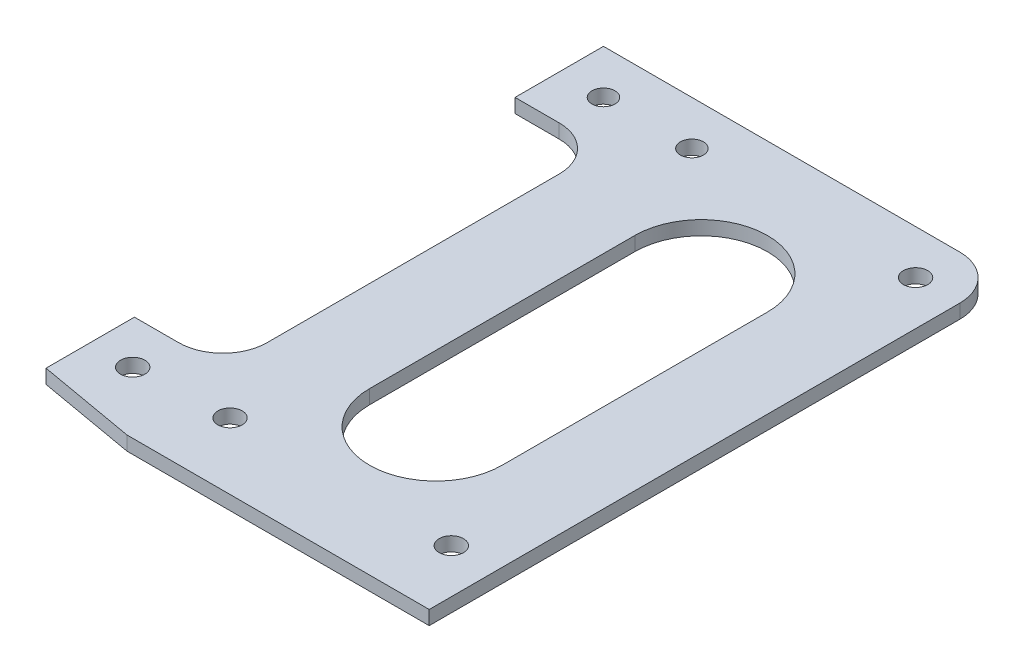
ISO-10303-21;
HEADER;
FILE_DESCRIPTION(('STEP AP214'),'2;1');
FILE_NAME('part.step','',(''),(''),'','','');
FILE_SCHEMA(('AUTOMOTIVE_DESIGN { 1 0 10303 214 1 1 1 1 }'));
ENDSEC;
DATA;
#1=APPLICATION_CONTEXT('core data for automotive mechanical design processes');
#2=APPLICATION_PROTOCOL_DEFINITION('international standard','automotive_design',2000,#1);
#3=PRODUCT_CONTEXT('',#1,'mechanical');
#4=PRODUCT('Part','Part','',(#3));
#5=PRODUCT_RELATED_PRODUCT_CATEGORY('part','',(#4));
#6=PRODUCT_DEFINITION_FORMATION('','',#4);
#7=PRODUCT_DEFINITION_CONTEXT('part definition',#1,'design');
#8=PRODUCT_DEFINITION('design','',#6,#7);
#9=PRODUCT_DEFINITION_SHAPE('','',#8);
#10=(LENGTH_UNIT() NAMED_UNIT(*) SI_UNIT(.MILLI.,.METRE.));
#11=(NAMED_UNIT(*) PLANE_ANGLE_UNIT() SI_UNIT($,.RADIAN.));
#12=(NAMED_UNIT(*) SI_UNIT($,.STERADIAN.) SOLID_ANGLE_UNIT());
#13=UNCERTAINTY_MEASURE_WITH_UNIT(LENGTH_MEASURE(1.E-05),#10,'distance_accuracy_value','');
#14=(GEOMETRIC_REPRESENTATION_CONTEXT(3) GLOBAL_UNCERTAINTY_ASSIGNED_CONTEXT((#13)) GLOBAL_UNIT_ASSIGNED_CONTEXT((#10,
#11,#12)) REPRESENTATION_CONTEXT('',''));
#15=CARTESIAN_POINT('',(0.,0.,0.));
#16=DIRECTION('',(0.,0.,1.));
#17=DIRECTION('',(1.,0.,0.));
#18=AXIS2_PLACEMENT_3D('',#15,#16,#17);
#19=CARTESIAN_POINT('',(-104.922239506293,35.3097367286682,-36.2734435331109));
#20=DIRECTION('',(-1.,0.,0.));
#21=DIRECTION('',(0.,0.,1.));
#22=AXIS2_PLACEMENT_3D('',#19,#20,#21);
#23=PLANE('',#22);
#24=DIRECTION('',(0.,1.,0.));
#25=VECTOR('',#24,1.);
#26=CARTESIAN_POINT('',(-104.922239506293,32.1347367286682,-142.35));
#27=LINE('',#26,#25);
#28=CARTESIAN_POINT('',(-104.922239506293,32.1347367286682,-142.35));
#29=VERTEX_POINT('',#28);
#30=CARTESIAN_POINT('',(-104.922239506293,35.3097367286682,-142.35));
#31=VERTEX_POINT('',#30);
#32=EDGE_CURVE('E204',#29,#31,#27,.T.);
#33=ORIENTED_EDGE('',*,*,#32,.T.);
#34=DIRECTION('',(0.,0.,-1.));
#35=VECTOR('',#34,1.);
#36=CARTESIAN_POINT('',(-104.922239506293,35.3097367286682,-36.2734435331109));
#37=LINE('',#36,#35);
#38=CARTESIAN_POINT('',(-104.922239506293,35.3097367286682,-162.35));
#39=VERTEX_POINT('',#38);
#40=EDGE_CURVE('E237',#31,#39,#37,.T.);
#41=ORIENTED_EDGE('',*,*,#40,.T.);
#42=DIRECTION('',(0.,-1.,0.));
#43=VECTOR('',#42,1.);
#44=CARTESIAN_POINT('',(-104.922239506293,35.3097367286682,-162.35));
#45=LINE('',#44,#43);
#46=CARTESIAN_POINT('',(-104.922239506293,32.1347367286682,-162.35));
#47=VERTEX_POINT('',#46);
#48=EDGE_CURVE('E270',#39,#47,#45,.T.);
#49=ORIENTED_EDGE('',*,*,#48,.T.);
#50=DIRECTION('',(0.,0.,-1.));
#51=VECTOR('',#50,1.);
#52=CARTESIAN_POINT('',(-104.922239506293,32.1347367286682,-36.2734435331109));
#53=LINE('',#52,#51);
#54=EDGE_CURVE('E255',#29,#47,#53,.T.);
#55=ORIENTED_EDGE('',*,*,#54,.F.);
#56=EDGE_LOOP('',(#33,#41,#49,#55));
#57=FACE_BOUND('',#56,.T.);
#58=ADVANCED_FACE('F34',(#57),#23,.T.);
#59=CARTESIAN_POINT('',(-14.3331001776119,35.3097367286682,-32.3499999999996));
#60=DIRECTION('',(0.,0.,1.));
#61=DIRECTION('',(1.,0.,0.));
#62=AXIS2_PLACEMENT_3D('',#59,#60,#61);
#63=PLANE('',#62);
#64=DIRECTION('',(-1.,0.,0.));
#65=VECTOR('',#64,1.);
#66=CARTESIAN_POINT('',(-14.3331001776119,32.1347367286682,-32.3499999999996));
#67=LINE('',#66,#65);
#68=CARTESIAN_POINT('',(-14.3331001776119,32.1347367286682,-32.3499999999996));
#69=VERTEX_POINT('',#68);
#70=CARTESIAN_POINT('',(-82.671285526662,32.1347367286682,-32.3499999999997));
#71=VERTEX_POINT('',#70);
#72=EDGE_CURVE('E219',#69,#71,#67,.T.);
#73=ORIENTED_EDGE('',*,*,#72,.F.);
#74=DIRECTION('',(0.,-1.,0.));
#75=VECTOR('',#74,1.);
#76=CARTESIAN_POINT('',(-14.3331001776119,35.3097367286682,-32.3499999999996));
#77=LINE('',#76,#75);
#78=CARTESIAN_POINT('',(-14.3331001776119,35.3097367286682,-32.3499999999996));
#79=VERTEX_POINT('',#78);
#80=EDGE_CURVE('E11',#79,#69,#77,.T.);
#81=ORIENTED_EDGE('',*,*,#80,.F.);
#82=DIRECTION('',(-1.,0.,0.));
#83=VECTOR('',#82,1.);
#84=CARTESIAN_POINT('',(-14.3331001776119,35.3097367286682,-32.3499999999996));
#85=LINE('',#84,#83);
#86=CARTESIAN_POINT('',(-82.671285526662,35.3097367286682,-32.3499999999997));
#87=VERTEX_POINT('',#86);
#88=EDGE_CURVE('E230',#79,#87,#85,.T.);
#89=ORIENTED_EDGE('',*,*,#88,.T.);
#90=DIRECTION('',(0.,-1.,0.));
#91=VECTOR('',#90,1.);
#92=CARTESIAN_POINT('',(-82.671285526662,35.3097367286682,-32.3499999999997));
#93=LINE('',#92,#91);
#94=EDGE_CURVE('E38',#87,#71,#93,.T.);
#95=ORIENTED_EDGE('',*,*,#94,.T.);
#96=EDGE_LOOP('',(#73,#81,#89,#95));
#97=FACE_BOUND('',#96,.T.);
#98=ADVANCED_FACE('F36',(#97),#63,.T.);
#99=CARTESIAN_POINT('',(-14.3331001776119,35.3097367286682,-152.35));
#100=DIRECTION('',(1.,0.,0.));
#101=DIRECTION('',(0.,0.,-1.));
#102=AXIS2_PLACEMENT_3D('',#99,#100,#101);
#103=PLANE('',#102);
#104=DIRECTION('',(0.,0.,1.));
#105=VECTOR('',#104,1.);
#106=CARTESIAN_POINT('',(-14.3331001776119,32.1347367286682,-152.35));
#107=LINE('',#106,#105);
#108=CARTESIAN_POINT('',(-14.3331001776119,32.1347367286682,-152.35));
#109=VERTEX_POINT('',#108);
#110=EDGE_CURVE('E234',#109,#69,#107,.T.);
#111=ORIENTED_EDGE('',*,*,#110,.F.);
#112=DIRECTION('',(0.,-1.,0.));
#113=VECTOR('',#112,1.);
#114=CARTESIAN_POINT('',(-14.3331001776119,35.3097367286682,-152.35));
#115=LINE('',#114,#113);
#116=CARTESIAN_POINT('',(-14.3331001776119,35.3097367286682,-152.35));
#117=VERTEX_POINT('',#116);
#118=EDGE_CURVE('E43',#117,#109,#115,.T.);
#119=ORIENTED_EDGE('',*,*,#118,.F.);
#120=DIRECTION('',(0.,0.,1.));
#121=VECTOR('',#120,1.);
#122=CARTESIAN_POINT('',(-14.3331001776119,35.3097367286682,-152.35));
#123=LINE('',#122,#121);
#124=EDGE_CURVE('E247',#117,#79,#123,.T.);
#125=ORIENTED_EDGE('',*,*,#124,.T.);
#126=ORIENTED_EDGE('',*,*,#80,.T.);
#127=EDGE_LOOP('',(#111,#119,#125,#126));
#128=FACE_BOUND('',#127,.T.);
#129=ADVANCED_FACE('F284',(#128),#103,.T.);
#130=CARTESIAN_POINT('',(-24.3331001776119,35.3097367286682,-152.35));
#131=DIRECTION('',(0.,-1.,0.));
#132=DIRECTION('',(0.,0.,-1.));
#133=AXIS2_PLACEMENT_3D('',#130,#131,#132);
#134=CYLINDRICAL_SURFACE('',#133,10.);
#135=CARTESIAN_POINT('',(-24.3331001776119,32.1347367286682,-152.35));
#136=DIRECTION('',(0.,-1.,0.));
#137=DIRECTION('',(0.,0.,-1.));
#138=AXIS2_PLACEMENT_3D('',#135,#136,#137);
#139=CIRCLE('',#138,10.);
#140=CARTESIAN_POINT('',(-24.3331001776119,32.1347367286682,-162.35));
#141=VERTEX_POINT('',#140);
#142=EDGE_CURVE('E262',#141,#109,#139,.T.);
#143=ORIENTED_EDGE('',*,*,#142,.F.);
#144=DIRECTION('',(0.,-1.,0.));
#145=VECTOR('',#144,1.);
#146=CARTESIAN_POINT('',(-24.3331001776119,35.3097367286682,-162.35));
#147=LINE('',#146,#145);
#148=CARTESIAN_POINT('',(-24.3331001776119,35.3097367286682,-162.35));
#149=VERTEX_POINT('',#148);
#150=EDGE_CURVE('E268',#149,#141,#147,.T.);
#151=ORIENTED_EDGE('',*,*,#150,.F.);
#152=CARTESIAN_POINT('',(-24.3331001776119,35.3097367286682,-152.35));
#153=DIRECTION('',(0.,-1.,0.));
#154=DIRECTION('',(0.,0.,-1.));
#155=AXIS2_PLACEMENT_3D('',#152,#153,#154);
#156=CIRCLE('',#155,10.);
#157=EDGE_CURVE('E244',#149,#117,#156,.T.);
#158=ORIENTED_EDGE('',*,*,#157,.T.);
#159=ORIENTED_EDGE('',*,*,#118,.T.);
#160=EDGE_LOOP('',(#143,#151,#158,#159));
#161=FACE_BOUND('',#160,.T.);
#162=ADVANCED_FACE('F321',(#161),#134,.T.);
#163=CARTESIAN_POINT('',(-104.922239506293,35.3097367286682,-162.35));
#164=DIRECTION('',(0.,0.,-1.));
#165=DIRECTION('',(-1.,0.,0.));
#166=AXIS2_PLACEMENT_3D('',#163,#164,#165);
#167=PLANE('',#166);
#168=DIRECTION('',(1.,0.,0.));
#169=VECTOR('',#168,1.);
#170=CARTESIAN_POINT('',(-104.922239506293,32.1347367286682,-162.35));
#171=LINE('',#170,#169);
#172=EDGE_CURVE('E259',#47,#141,#171,.T.);
#173=ORIENTED_EDGE('',*,*,#172,.F.);
#174=ORIENTED_EDGE('',*,*,#48,.F.);
#175=DIRECTION('',(1.,0.,0.));
#176=VECTOR('',#175,1.);
#177=CARTESIAN_POINT('',(-104.922239506293,35.3097367286682,-162.35));
#178=LINE('',#177,#176);
#179=EDGE_CURVE('E241',#39,#149,#178,.T.);
#180=ORIENTED_EDGE('',*,*,#179,.T.);
#181=ORIENTED_EDGE('',*,*,#150,.T.);
#182=EDGE_LOOP('',(#173,#174,#180,#181));
#183=FACE_BOUND('',#182,.T.);
#184=ADVANCED_FACE('F319',(#183),#167,.T.);
#185=DIRECTION('',(0.,1.,0.));
#186=VECTOR('',#185,1.);
#187=CARTESIAN_POINT('',(-104.922239506293,32.1347367286682,-56.2734435331109));
#188=LINE('',#187,#186);
#189=CARTESIAN_POINT('',(-104.922239506293,32.1347367286682,-56.2734435331109));
#190=VERTEX_POINT('',#189);
#191=CARTESIAN_POINT('',(-104.922239506293,35.3097367286682,-56.2734435331109));
#192=VERTEX_POINT('',#191);
#193=EDGE_CURVE('E226',#190,#192,#188,.T.);
#194=ORIENTED_EDGE('',*,*,#193,.F.);
#195=CARTESIAN_POINT('',(-104.922239506293,32.1347367286682,-36.2734435331109));
#196=VERTEX_POINT('',#195);
#197=EDGE_CURVE('E256',#196,#190,#53,.T.);
#198=ORIENTED_EDGE('',*,*,#197,.F.);
#199=DIRECTION('',(0.,-1.,0.));
#200=VECTOR('',#199,1.);
#201=CARTESIAN_POINT('',(-104.922239506293,35.3097367286682,-36.2734435331109));
#202=LINE('',#201,#200);
#203=CARTESIAN_POINT('',(-104.922239506293,35.3097367286682,-36.2734435331109));
#204=VERTEX_POINT('',#203);
#205=EDGE_CURVE('E272',#204,#196,#202,.T.);
#206=ORIENTED_EDGE('',*,*,#205,.F.);
#207=EDGE_CURVE('E238',#204,#192,#37,.T.);
#208=ORIENTED_EDGE('',*,*,#207,.T.);
#209=EDGE_LOOP('',(#194,#198,#206,#208));
#210=FACE_BOUND('',#209,.T.);
#211=ADVANCED_FACE('F295',(#210),#23,.T.);
#212=CARTESIAN_POINT('',(-82.671285526662,35.3097367286682,-32.3499999999997));
#213=DIRECTION('',(-0.173648177666928,0.,0.984807753012208));
#214=DIRECTION('',(0.984807753012208,0.,0.173648177666928));
#215=AXIS2_PLACEMENT_3D('',#212,#213,#214);
#216=PLANE('',#215);
#217=DIRECTION('',(-0.984807753012208,0.,-0.173648177666928));
#218=VECTOR('',#217,1.);
#219=CARTESIAN_POINT('',(-82.671285526662,32.1347367286682,-32.3499999999997));
#220=LINE('',#219,#218);
#221=EDGE_CURVE('E252',#71,#196,#220,.T.);
#222=ORIENTED_EDGE('',*,*,#221,.F.);
#223=ORIENTED_EDGE('',*,*,#94,.F.);
#224=DIRECTION('',(-0.984807753012208,0.,-0.173648177666928));
#225=VECTOR('',#224,1.);
#226=CARTESIAN_POINT('',(-82.671285526662,35.3097367286682,-32.3499999999997));
#227=LINE('',#226,#225);
#228=EDGE_CURVE('E233',#87,#204,#227,.T.);
#229=ORIENTED_EDGE('',*,*,#228,.T.);
#230=ORIENTED_EDGE('',*,*,#205,.T.);
#231=EDGE_LOOP('',(#222,#223,#229,#230));
#232=FACE_BOUND('',#231,.T.);
#233=ADVANCED_FACE('F280',(#232),#216,.T.);
#234=CARTESIAN_POINT('',(-24.3331001776119,35.3097367286682,-152.35));
#235=DIRECTION('',(0.,-1.,0.));
#236=DIRECTION('',(0.,0.,-1.));
#237=AXIS2_PLACEMENT_3D('',#234,#235,#236);
#238=PLANE('',#237);
#239=CARTESIAN_POINT('',(-95.3160583972932,35.3097367286682,-46.2734435331109));
#240=DIRECTION('',(0.,-1.,0.));
#241=DIRECTION('',(0.,0.,-1.));
#242=AXIS2_PLACEMENT_3D('',#239,#240,#241);
#243=CIRCLE('',#242,2.74999999999999);
#244=CARTESIAN_POINT('',(-95.3160583972932,35.3097367286682,-49.0234435331109));
#245=VERTEX_POINT('',#244);
#246=EDGE_CURVE('E400',#245,#245,#243,.T.);
#247=ORIENTED_EDGE('',*,*,#246,.T.);
#248=EDGE_LOOP('',(#247));
#249=FACE_BOUND('',#248,.T.);
#250=CARTESIAN_POINT('',(-74.375466885923,35.3097367286682,-47.3499999999996));
#251=DIRECTION('',(0.,-1.,0.));
#252=DIRECTION('',(0.,0.,-1.));
#253=AXIS2_PLACEMENT_3D('',#250,#251,#252);
#254=CIRCLE('',#253,2.74999999999999);
#255=CARTESIAN_POINT('',(-74.375466885923,35.3097367286682,-50.0999999999996));
#256=VERTEX_POINT('',#255);
#257=EDGE_CURVE('E410',#256,#256,#254,.T.);
#258=ORIENTED_EDGE('',*,*,#257,.T.);
#259=EDGE_LOOP('',(#258));
#260=FACE_BOUND('',#259,.T.);
#261=CARTESIAN_POINT('',(-24.3331001776119,35.3097367286682,-47.3499999999996));
#262=DIRECTION('',(0.,-1.,0.));
#263=DIRECTION('',(0.,0.,-1.));
#264=AXIS2_PLACEMENT_3D('',#261,#262,#263);
#265=CIRCLE('',#264,2.74999999999999);
#266=CARTESIAN_POINT('',(-24.3331001776119,35.3097367286682,-50.0999999999996));
#267=VERTEX_POINT('',#266);
#268=EDGE_CURVE('E416',#267,#267,#265,.T.);
#269=ORIENTED_EDGE('',*,*,#268,.T.);
#270=EDGE_LOOP('',(#269));
#271=FACE_BOUND('',#270,.T.);
#272=CARTESIAN_POINT('',(-24.3331001776119,35.3097367286682,-152.35));
#273=DIRECTION('',(0.,-1.,0.));
#274=DIRECTION('',(0.,0.,-1.));
#275=AXIS2_PLACEMENT_3D('',#272,#273,#274);
#276=CIRCLE('',#275,2.74999999999999);
#277=CARTESIAN_POINT('',(-24.3331001776119,35.3097367286682,-155.1));
#278=VERTEX_POINT('',#277);
#279=EDGE_CURVE('E422',#278,#278,#276,.T.);
#280=ORIENTED_EDGE('',*,*,#279,.T.);
#281=EDGE_LOOP('',(#280));
#282=FACE_BOUND('',#281,.T.);
#283=CARTESIAN_POINT('',(-94.922239506293,35.3097367286682,-152.35));
#284=DIRECTION('',(0.,-1.,0.));
#285=DIRECTION('',(0.,0.,-1.));
#286=AXIS2_PLACEMENT_3D('',#283,#284,#285);
#287=CIRCLE('',#286,2.59999999999998);
#288=CARTESIAN_POINT('',(-94.922239506293,35.3097367286682,-154.95));
#289=VERTEX_POINT('',#288);
#290=EDGE_CURVE('E428',#289,#289,#287,.T.);
#291=ORIENTED_EDGE('',*,*,#290,.T.);
#292=EDGE_LOOP('',(#291));
#293=FACE_BOUND('',#292,.T.);
#294=CARTESIAN_POINT('',(-74.922239506293,35.3097367286682,-152.35));
#295=DIRECTION('',(0.,-1.,0.));
#296=DIRECTION('',(0.,0.,-1.));
#297=AXIS2_PLACEMENT_3D('',#294,#295,#296);
#298=CIRCLE('',#297,2.59999999999998);
#299=CARTESIAN_POINT('',(-74.922239506293,35.3097367286682,-154.95));
#300=VERTEX_POINT('',#299);
#301=EDGE_CURVE('E172',#300,#300,#298,.T.);
#302=ORIENTED_EDGE('',*,*,#301,.T.);
#303=EDGE_LOOP('',(#302));
#304=FACE_BOUND('',#303,.T.);
#305=DIRECTION('',(0.,0.,1.));
#306=VECTOR('',#305,1.);
#307=CARTESIAN_POINT('',(-64.3331001776119,35.3097367286682,-128.85));
#308=LINE('',#307,#306);
#309=CARTESIAN_POINT('',(-64.3331001776119,35.3097367286682,-128.85));
#310=VERTEX_POINT('',#309);
#311=CARTESIAN_POINT('',(-64.333100177612,35.3097367286682,-68.8499999999997));
#312=VERTEX_POINT('',#311);
#313=EDGE_CURVE('E178',#310,#312,#308,.T.);
#314=ORIENTED_EDGE('',*,*,#313,.F.);
#315=CARTESIAN_POINT('',(-49.3331001776118,35.3097367286682,-128.85));
#316=DIRECTION('',(0.,1.,0.));
#317=DIRECTION('',(0.,0.,1.));
#318=AXIS2_PLACEMENT_3D('',#315,#316,#317);
#319=CIRCLE('',#318,15.);
#320=CARTESIAN_POINT('',(-34.3331001776118,35.3097367286682,-128.85));
#321=VERTEX_POINT('',#320);
#322=EDGE_CURVE('E51',#321,#310,#319,.T.);
#323=ORIENTED_EDGE('',*,*,#322,.F.);
#324=DIRECTION('',(0.,0.,-1.));
#325=VECTOR('',#324,1.);
#326=CARTESIAN_POINT('',(-34.3331001776119,35.3097367286682,-68.8499999999996));
#327=LINE('',#326,#325);
#328=CARTESIAN_POINT('',(-34.3331001776119,35.3097367286682,-68.8499999999996));
#329=VERTEX_POINT('',#328);
#330=EDGE_CURVE('E166',#329,#321,#327,.T.);
#331=ORIENTED_EDGE('',*,*,#330,.F.);
#332=CARTESIAN_POINT('',(-49.333100177612,35.3097367286682,-68.8499999999996));
#333=DIRECTION('',(0.,1.,0.));
#334=DIRECTION('',(0.,0.,1.));
#335=AXIS2_PLACEMENT_3D('',#332,#333,#334);
#336=CIRCLE('',#335,15.);
#337=EDGE_CURVE('E169',#312,#329,#336,.T.);
#338=ORIENTED_EDGE('',*,*,#337,.F.);
#339=EDGE_LOOP('',(#314,#323,#331,#338));
#340=FACE_BOUND('',#339,.T.);
#341=ORIENTED_EDGE('',*,*,#40,.F.);
#342=DIRECTION('',(-1.,0.,0.));
#343=VECTOR('',#342,1.);
#344=CARTESIAN_POINT('',(-94.922239506293,35.3097367286682,-142.35));
#345=LINE('',#344,#343);
#346=CARTESIAN_POINT('',(-94.922239506293,35.3097367286682,-142.35));
#347=VERTEX_POINT('',#346);
#348=EDGE_CURVE('E184',#347,#31,#345,.T.);
#349=ORIENTED_EDGE('',*,*,#348,.F.);
#350=CARTESIAN_POINT('',(-94.922239506293,35.3097367286682,-132.35));
#351=DIRECTION('',(0.,1.,0.));
#352=DIRECTION('',(0.,0.,1.));
#353=AXIS2_PLACEMENT_3D('',#350,#351,#352);
#354=CIRCLE('',#353,10.);
#355=CARTESIAN_POINT('',(-84.922239506293,35.3097367286682,-132.35));
#356=VERTEX_POINT('',#355);
#357=EDGE_CURVE('E192',#356,#347,#354,.T.);
#358=ORIENTED_EDGE('',*,*,#357,.F.);
#359=DIRECTION('',(0.,0.,-1.));
#360=VECTOR('',#359,1.);
#361=CARTESIAN_POINT('',(-84.922239506293,35.3097367286682,-66.2734435331109));
#362=LINE('',#361,#360);
#363=CARTESIAN_POINT('',(-84.922239506293,35.3097367286682,-66.2734435331109));
#364=VERTEX_POINT('',#363);
#365=EDGE_CURVE('E212',#364,#356,#362,.T.);
#366=ORIENTED_EDGE('',*,*,#365,.F.);
#367=CARTESIAN_POINT('',(-94.922239506293,35.3097367286682,-66.2734435331109));
#368=DIRECTION('',(0.,1.,0.));
#369=DIRECTION('',(0.,0.,1.));
#370=AXIS2_PLACEMENT_3D('',#367,#368,#369);
#371=CIRCLE('',#370,10.);
#372=CARTESIAN_POINT('',(-94.922239506293,35.3097367286682,-56.2734435331109));
#373=VERTEX_POINT('',#372);
#374=EDGE_CURVE('E209',#373,#364,#371,.T.);
#375=ORIENTED_EDGE('',*,*,#374,.F.);
#376=DIRECTION('',(1.,0.,0.));
#377=VECTOR('',#376,1.);
#378=CARTESIAN_POINT('',(-104.922239506293,35.3097367286682,-56.2734435331109));
#379=LINE('',#378,#377);
#380=EDGE_CURVE('E206',#192,#373,#379,.T.);
#381=ORIENTED_EDGE('',*,*,#380,.F.);
#382=ORIENTED_EDGE('',*,*,#207,.F.);
#383=ORIENTED_EDGE('',*,*,#228,.F.);
#384=ORIENTED_EDGE('',*,*,#88,.F.);
#385=ORIENTED_EDGE('',*,*,#124,.F.);
#386=ORIENTED_EDGE('',*,*,#157,.F.);
#387=ORIENTED_EDGE('',*,*,#179,.F.);
#388=EDGE_LOOP('',(#341,#349,#358,#366,#375,#381,#382,#383,#384,#385,#386,#387));
#389=FACE_BOUND('',#388,.T.);
#390=ADVANCED_FACE('F288',(#249,#260,#271,#282,#293,#304,#340,#389),#238,.F.);
#391=CARTESIAN_POINT('',(-24.3331001776119,32.1347367286682,-152.35));
#392=DIRECTION('',(0.,-1.,0.));
#393=DIRECTION('',(0.,0.,-1.));
#394=AXIS2_PLACEMENT_3D('',#391,#392,#393);
#395=PLANE('',#394);
#396=CARTESIAN_POINT('',(-95.3160583972932,32.1347367286682,-46.2734435331109));
#397=DIRECTION('',(0.,-1.,0.));
#398=DIRECTION('',(0.,0.,-1.));
#399=AXIS2_PLACEMENT_3D('',#396,#397,#398);
#400=CIRCLE('',#399,2.74999999999999);
#401=CARTESIAN_POINT('',(-95.3160583972932,32.1347367286682,-49.0234435331109));
#402=VERTEX_POINT('',#401);
#403=EDGE_CURVE('E403',#402,#402,#400,.T.);
#404=ORIENTED_EDGE('',*,*,#403,.F.);
#405=EDGE_LOOP('',(#404));
#406=FACE_BOUND('',#405,.T.);
#407=CARTESIAN_POINT('',(-74.375466885923,32.1347367286682,-47.3499999999996));
#408=DIRECTION('',(0.,-1.,0.));
#409=DIRECTION('',(0.,0.,-1.));
#410=AXIS2_PLACEMENT_3D('',#407,#408,#409);
#411=CIRCLE('',#410,2.74999999999999);
#412=CARTESIAN_POINT('',(-74.375466885923,32.1347367286682,-50.0999999999996));
#413=VERTEX_POINT('',#412);
#414=EDGE_CURVE('E405',#413,#413,#411,.T.);
#415=ORIENTED_EDGE('',*,*,#414,.F.);
#416=EDGE_LOOP('',(#415));
#417=FACE_BOUND('',#416,.T.);
#418=CARTESIAN_POINT('',(-24.3331001776119,32.1347367286682,-47.3499999999996));
#419=DIRECTION('',(0.,-1.,0.));
#420=DIRECTION('',(0.,0.,-1.));
#421=AXIS2_PLACEMENT_3D('',#418,#419,#420);
#422=CIRCLE('',#421,2.74999999999999);
#423=CARTESIAN_POINT('',(-24.3331001776119,32.1347367286682,-50.0999999999996));
#424=VERTEX_POINT('',#423);
#425=EDGE_CURVE('E413',#424,#424,#422,.T.);
#426=ORIENTED_EDGE('',*,*,#425,.F.);
#427=EDGE_LOOP('',(#426));
#428=FACE_BOUND('',#427,.T.);
#429=CARTESIAN_POINT('',(-24.3331001776119,32.1347367286682,-152.35));
#430=DIRECTION('',(0.,-1.,0.));
#431=DIRECTION('',(0.,0.,-1.));
#432=AXIS2_PLACEMENT_3D('',#429,#430,#431);
#433=CIRCLE('',#432,2.74999999999999);
#434=CARTESIAN_POINT('',(-24.3331001776119,32.1347367286682,-155.1));
#435=VERTEX_POINT('',#434);
#436=EDGE_CURVE('E419',#435,#435,#433,.T.);
#437=ORIENTED_EDGE('',*,*,#436,.F.);
#438=EDGE_LOOP('',(#437));
#439=FACE_BOUND('',#438,.T.);
#440=CARTESIAN_POINT('',(-94.922239506293,32.1347367286682,-152.35));
#441=DIRECTION('',(0.,-1.,0.));
#442=DIRECTION('',(0.,0.,-1.));
#443=AXIS2_PLACEMENT_3D('',#440,#441,#442);
#444=CIRCLE('',#443,2.59999999999998);
#445=CARTESIAN_POINT('',(-94.922239506293,32.1347367286682,-154.95));
#446=VERTEX_POINT('',#445);
#447=EDGE_CURVE('E425',#446,#446,#444,.T.);
#448=ORIENTED_EDGE('',*,*,#447,.F.);
#449=EDGE_LOOP('',(#448));
#450=FACE_BOUND('',#449,.T.);
#451=CARTESIAN_POINT('',(-74.922239506293,32.1347367286682,-152.35));
#452=DIRECTION('',(0.,-1.,0.));
#453=DIRECTION('',(0.,0.,-1.));
#454=AXIS2_PLACEMENT_3D('',#451,#452,#453);
#455=CIRCLE('',#454,2.59999999999998);
#456=CARTESIAN_POINT('',(-74.922239506293,32.1347367286682,-154.95));
#457=VERTEX_POINT('',#456);
#458=EDGE_CURVE('E430',#457,#457,#455,.T.);
#459=ORIENTED_EDGE('',*,*,#458,.F.);
#460=EDGE_LOOP('',(#459));
#461=FACE_BOUND('',#460,.T.);
#462=CARTESIAN_POINT('',(-49.3331001776118,32.1347367286682,-128.85));
#463=DIRECTION('',(0.,1.,0.));
#464=DIRECTION('',(0.,0.,1.));
#465=AXIS2_PLACEMENT_3D('',#462,#463,#464);
#466=CIRCLE('',#465,15.);
#467=CARTESIAN_POINT('',(-34.3331001776118,32.1347367286682,-128.85));
#468=VERTEX_POINT('',#467);
#469=CARTESIAN_POINT('',(-64.3331001776119,32.1347367286682,-128.85));
#470=VERTEX_POINT('',#469);
#471=EDGE_CURVE('E150',#468,#470,#466,.T.);
#472=ORIENTED_EDGE('',*,*,#471,.T.);
#473=DIRECTION('',(0.,0.,1.));
#474=VECTOR('',#473,1.);
#475=CARTESIAN_POINT('',(-64.3331001776119,32.1347367286682,-128.85));
#476=LINE('',#475,#474);
#477=CARTESIAN_POINT('',(-64.333100177612,32.1347367286682,-68.8499999999997));
#478=VERTEX_POINT('',#477);
#479=EDGE_CURVE('E159',#470,#478,#476,.T.);
#480=ORIENTED_EDGE('',*,*,#479,.T.);
#481=CARTESIAN_POINT('',(-49.333100177612,32.1347367286682,-68.8499999999996));
#482=DIRECTION('',(0.,1.,0.));
#483=DIRECTION('',(0.,0.,1.));
#484=AXIS2_PLACEMENT_3D('',#481,#482,#483);
#485=CIRCLE('',#484,15.);
#486=CARTESIAN_POINT('',(-34.3331001776119,32.1347367286682,-68.8499999999996));
#487=VERTEX_POINT('',#486);
#488=EDGE_CURVE('E59',#478,#487,#485,.T.);
#489=ORIENTED_EDGE('',*,*,#488,.T.);
#490=DIRECTION('',(0.,0.,-1.));
#491=VECTOR('',#490,1.);
#492=CARTESIAN_POINT('',(-34.3331001776119,32.1347367286682,-68.8499999999996));
#493=LINE('',#492,#491);
#494=EDGE_CURVE('E156',#487,#468,#493,.T.);
#495=ORIENTED_EDGE('',*,*,#494,.T.);
#496=EDGE_LOOP('',(#472,#480,#489,#495));
#497=FACE_BOUND('',#496,.T.);
#498=DIRECTION('',(-1.,0.,0.));
#499=VECTOR('',#498,1.);
#500=CARTESIAN_POINT('',(-94.922239506293,32.1347367286682,-142.35));
#501=LINE('',#500,#499);
#502=CARTESIAN_POINT('',(-94.922239506293,32.1347367286682,-142.35));
#503=VERTEX_POINT('',#502);
#504=EDGE_CURVE('E188',#503,#29,#501,.T.);
#505=ORIENTED_EDGE('',*,*,#504,.T.);
#506=ORIENTED_EDGE('',*,*,#54,.T.);
#507=ORIENTED_EDGE('',*,*,#172,.T.);
#508=ORIENTED_EDGE('',*,*,#142,.T.);
#509=ORIENTED_EDGE('',*,*,#110,.T.);
#510=ORIENTED_EDGE('',*,*,#72,.T.);
#511=ORIENTED_EDGE('',*,*,#221,.T.);
#512=ORIENTED_EDGE('',*,*,#197,.T.);
#513=DIRECTION('',(1.,0.,0.));
#514=VECTOR('',#513,1.);
#515=CARTESIAN_POINT('',(-104.922239506293,32.1347367286682,-56.2734435331109));
#516=LINE('',#515,#514);
#517=CARTESIAN_POINT('',(-94.922239506293,32.1347367286682,-56.2734435331109));
#518=VERTEX_POINT('',#517);
#519=EDGE_CURVE('E191',#190,#518,#516,.T.);
#520=ORIENTED_EDGE('',*,*,#519,.T.);
#521=CARTESIAN_POINT('',(-94.922239506293,32.1347367286682,-66.2734435331109));
#522=DIRECTION('',(0.,1.,0.));
#523=DIRECTION('',(0.,0.,1.));
#524=AXIS2_PLACEMENT_3D('',#521,#522,#523);
#525=CIRCLE('',#524,10.);
#526=CARTESIAN_POINT('',(-84.922239506293,32.1347367286682,-66.2734435331109));
#527=VERTEX_POINT('',#526);
#528=EDGE_CURVE('E195',#518,#527,#525,.T.);
#529=ORIENTED_EDGE('',*,*,#528,.T.);
#530=DIRECTION('',(0.,0.,-1.));
#531=VECTOR('',#530,1.);
#532=CARTESIAN_POINT('',(-84.922239506293,32.1347367286682,-66.2734435331109));
#533=LINE('',#532,#531);
#534=CARTESIAN_POINT('',(-84.922239506293,32.1347367286682,-132.35));
#535=VERTEX_POINT('',#534);
#536=EDGE_CURVE('E198',#527,#535,#533,.T.);
#537=ORIENTED_EDGE('',*,*,#536,.T.);
#538=CARTESIAN_POINT('',(-94.922239506293,32.1347367286682,-132.35));
#539=DIRECTION('',(0.,1.,0.));
#540=DIRECTION('',(0.,0.,1.));
#541=AXIS2_PLACEMENT_3D('',#538,#539,#540);
#542=CIRCLE('',#541,10.);
#543=EDGE_CURVE('E201',#535,#503,#542,.T.);
#544=ORIENTED_EDGE('',*,*,#543,.T.);
#545=EDGE_LOOP('',(#505,#506,#507,#508,#509,#510,#511,#512,#520,#529,#537,#544));
#546=FACE_BOUND('',#545,.T.);
#547=ADVANCED_FACE('F163',(#406,#417,#428,#439,#450,#461,#497,#546),#395,.T.);
#548=CARTESIAN_POINT('',(-94.922239506293,32.1347367286682,-142.35));
#549=DIRECTION('',(0.,0.,-1.));
#550=DIRECTION('',(-1.,0.,0.));
#551=AXIS2_PLACEMENT_3D('',#548,#549,#550);
#552=PLANE('',#551);
#553=ORIENTED_EDGE('',*,*,#348,.T.);
#554=ORIENTED_EDGE('',*,*,#32,.F.);
#555=ORIENTED_EDGE('',*,*,#504,.F.);
#556=DIRECTION('',(0.,1.,0.));
#557=VECTOR('',#556,1.);
#558=CARTESIAN_POINT('',(-94.922239506293,32.1347367286682,-142.35));
#559=LINE('',#558,#557);
#560=EDGE_CURVE('E217',#503,#347,#559,.T.);
#561=ORIENTED_EDGE('',*,*,#560,.T.);
#562=EDGE_LOOP('',(#553,#554,#555,#561));
#563=FACE_BOUND('',#562,.T.);
#564=ADVANCED_FACE('F313',(#563),#552,.F.);
#565=CARTESIAN_POINT('',(-94.922239506293,32.1347367286682,-132.35));
#566=DIRECTION('',(0.,1.,0.));
#567=DIRECTION('',(0.,0.,1.));
#568=AXIS2_PLACEMENT_3D('',#565,#566,#567);
#569=CYLINDRICAL_SURFACE('',#568,10.);
#570=ORIENTED_EDGE('',*,*,#357,.T.);
#571=ORIENTED_EDGE('',*,*,#560,.F.);
#572=ORIENTED_EDGE('',*,*,#543,.F.);
#573=DIRECTION('',(0.,1.,0.));
#574=VECTOR('',#573,1.);
#575=CARTESIAN_POINT('',(-84.922239506293,32.1347367286682,-132.35));
#576=LINE('',#575,#574);
#577=EDGE_CURVE('E220',#535,#356,#576,.T.);
#578=ORIENTED_EDGE('',*,*,#577,.T.);
#579=EDGE_LOOP('',(#570,#571,#572,#578));
#580=FACE_BOUND('',#579,.T.);
#581=ADVANCED_FACE('F309',(#580),#569,.F.);
#582=CARTESIAN_POINT('',(-84.922239506293,32.1347367286682,-66.2734435331109));
#583=DIRECTION('',(1.,0.,0.));
#584=DIRECTION('',(0.,0.,-1.));
#585=AXIS2_PLACEMENT_3D('',#582,#583,#584);
#586=PLANE('',#585);
#587=ORIENTED_EDGE('',*,*,#365,.T.);
#588=ORIENTED_EDGE('',*,*,#577,.F.);
#589=ORIENTED_EDGE('',*,*,#536,.F.);
#590=DIRECTION('',(0.,1.,0.));
#591=VECTOR('',#590,1.);
#592=CARTESIAN_POINT('',(-84.922239506293,32.1347367286682,-66.2734435331109));
#593=LINE('',#592,#591);
#594=EDGE_CURVE('E222',#527,#364,#593,.T.);
#595=ORIENTED_EDGE('',*,*,#594,.T.);
#596=EDGE_LOOP('',(#587,#588,#589,#595));
#597=FACE_BOUND('',#596,.T.);
#598=ADVANCED_FACE('F304',(#597),#586,.F.);
#599=CARTESIAN_POINT('',(-94.922239506293,32.1347367286682,-66.2734435331109));
#600=DIRECTION('',(0.,1.,0.));
#601=DIRECTION('',(0.,0.,1.));
#602=AXIS2_PLACEMENT_3D('',#599,#600,#601);
#603=CYLINDRICAL_SURFACE('',#602,10.);
#604=ORIENTED_EDGE('',*,*,#374,.T.);
#605=ORIENTED_EDGE('',*,*,#594,.F.);
#606=ORIENTED_EDGE('',*,*,#528,.F.);
#607=DIRECTION('',(0.,1.,0.));
#608=VECTOR('',#607,1.);
#609=CARTESIAN_POINT('',(-94.922239506293,32.1347367286682,-56.2734435331109));
#610=LINE('',#609,#608);
#611=EDGE_CURVE('E224',#518,#373,#610,.T.);
#612=ORIENTED_EDGE('',*,*,#611,.T.);
#613=EDGE_LOOP('',(#604,#605,#606,#612));
#614=FACE_BOUND('',#613,.T.);
#615=ADVANCED_FACE('F300',(#614),#603,.F.);
#616=CARTESIAN_POINT('',(-104.922239506293,32.1347367286682,-56.2734435331109));
#617=DIRECTION('',(0.,0.,1.));
#618=DIRECTION('',(1.,0.,0.));
#619=AXIS2_PLACEMENT_3D('',#616,#617,#618);
#620=PLANE('',#619);
#621=ORIENTED_EDGE('',*,*,#380,.T.);
#622=ORIENTED_EDGE('',*,*,#611,.F.);
#623=ORIENTED_EDGE('',*,*,#519,.F.);
#624=ORIENTED_EDGE('',*,*,#193,.T.);
#625=EDGE_LOOP('',(#621,#622,#623,#624));
#626=FACE_BOUND('',#625,.T.);
#627=ADVANCED_FACE('F298',(#626),#620,.F.);
#628=CARTESIAN_POINT('',(-49.3331001776118,32.1347367286682,-128.85));
#629=DIRECTION('',(0.,1.,0.));
#630=DIRECTION('',(0.,0.,1.));
#631=AXIS2_PLACEMENT_3D('',#628,#629,#630);
#632=CYLINDRICAL_SURFACE('',#631,15.);
#633=ORIENTED_EDGE('',*,*,#322,.T.);
#634=DIRECTION('',(0.,1.,0.));
#635=VECTOR('',#634,1.);
#636=CARTESIAN_POINT('',(-64.3331001776119,32.1347367286682,-128.85));
#637=LINE('',#636,#635);
#638=EDGE_CURVE('E146',#470,#310,#637,.T.);
#639=ORIENTED_EDGE('',*,*,#638,.F.);
#640=ORIENTED_EDGE('',*,*,#471,.F.);
#641=DIRECTION('',(0.,1.,0.));
#642=VECTOR('',#641,1.);
#643=CARTESIAN_POINT('',(-34.3331001776118,32.1347367286682,-128.85));
#644=LINE('',#643,#642);
#645=EDGE_CURVE('E182',#468,#321,#644,.T.);
#646=ORIENTED_EDGE('',*,*,#645,.T.);
#647=EDGE_LOOP('',(#633,#639,#640,#646));
#648=FACE_BOUND('',#647,.T.);
#649=ADVANCED_FACE('F148',(#648),#632,.F.);
#650=CARTESIAN_POINT('',(-34.3331001776119,32.1347367286682,-68.8499999999996));
#651=DIRECTION('',(1.,0.,0.));
#652=DIRECTION('',(0.,0.,-1.));
#653=AXIS2_PLACEMENT_3D('',#650,#651,#652);
#654=PLANE('',#653);
#655=ORIENTED_EDGE('',*,*,#330,.T.);
#656=ORIENTED_EDGE('',*,*,#645,.F.);
#657=ORIENTED_EDGE('',*,*,#494,.F.);
#658=DIRECTION('',(0.,1.,0.));
#659=VECTOR('',#658,1.);
#660=CARTESIAN_POINT('',(-34.3331001776119,32.1347367286682,-68.8499999999996));
#661=LINE('',#660,#659);
#662=EDGE_CURVE('E185',#487,#329,#661,.T.);
#663=ORIENTED_EDGE('',*,*,#662,.T.);
#664=EDGE_LOOP('',(#655,#656,#657,#663));
#665=FACE_BOUND('',#664,.T.);
#666=ADVANCED_FACE('F364',(#665),#654,.F.);
#667=CARTESIAN_POINT('',(-49.333100177612,32.1347367286682,-68.8499999999996));
#668=DIRECTION('',(0.,1.,0.));
#669=DIRECTION('',(0.,0.,1.));
#670=AXIS2_PLACEMENT_3D('',#667,#668,#669);
#671=CYLINDRICAL_SURFACE('',#670,15.);
#672=ORIENTED_EDGE('',*,*,#337,.T.);
#673=ORIENTED_EDGE('',*,*,#662,.F.);
#674=ORIENTED_EDGE('',*,*,#488,.F.);
#675=DIRECTION('',(0.,1.,0.));
#676=VECTOR('',#675,1.);
#677=CARTESIAN_POINT('',(-64.333100177612,32.1347367286682,-68.8499999999997));
#678=LINE('',#677,#676);
#679=EDGE_CURVE('E155',#478,#312,#678,.T.);
#680=ORIENTED_EDGE('',*,*,#679,.T.);
#681=EDGE_LOOP('',(#672,#673,#674,#680));
#682=FACE_BOUND('',#681,.T.);
#683=ADVANCED_FACE('F368',(#682),#671,.F.);
#684=CARTESIAN_POINT('',(-64.3331001776119,32.1347367286682,-128.85));
#685=DIRECTION('',(-1.,0.,0.));
#686=DIRECTION('',(0.,0.,1.));
#687=AXIS2_PLACEMENT_3D('',#684,#685,#686);
#688=PLANE('',#687);
#689=ORIENTED_EDGE('',*,*,#313,.T.);
#690=ORIENTED_EDGE('',*,*,#679,.F.);
#691=ORIENTED_EDGE('',*,*,#479,.F.);
#692=ORIENTED_EDGE('',*,*,#638,.T.);
#693=EDGE_LOOP('',(#689,#690,#691,#692));
#694=FACE_BOUND('',#693,.T.);
#695=ADVANCED_FACE('F160',(#694),#688,.F.);
#696=CARTESIAN_POINT('',(-74.922239506293,32.1347367286682,-152.35));
#697=DIRECTION('',(0.,-1.,0.));
#698=DIRECTION('',(0.,0.,-1.));
#699=AXIS2_PLACEMENT_3D('',#696,#697,#698);
#700=CYLINDRICAL_SURFACE('',#699,2.59999999999998);
#701=ORIENTED_EDGE('',*,*,#301,.F.);
#702=EDGE_LOOP('',(#701));
#703=FACE_BOUND('',#702,.T.);
#704=ORIENTED_EDGE('',*,*,#458,.T.);
#705=EDGE_LOOP('',(#704));
#706=FACE_BOUND('',#705,.T.);
#707=ADVANCED_FACE('F367',(#703,#706),#700,.F.);
#708=CARTESIAN_POINT('',(-94.922239506293,32.1347367286682,-152.35));
#709=DIRECTION('',(0.,-1.,0.));
#710=DIRECTION('',(0.,0.,-1.));
#711=AXIS2_PLACEMENT_3D('',#708,#709,#710);
#712=CYLINDRICAL_SURFACE('',#711,2.59999999999998);
#713=ORIENTED_EDGE('',*,*,#290,.F.);
#714=EDGE_LOOP('',(#713));
#715=FACE_BOUND('',#714,.T.);
#716=ORIENTED_EDGE('',*,*,#447,.T.);
#717=EDGE_LOOP('',(#716));
#718=FACE_BOUND('',#717,.T.);
#719=ADVANCED_FACE('F376',(#715,#718),#712,.F.);
#720=CARTESIAN_POINT('',(-24.3331001776119,32.1347367286682,-152.35));
#721=DIRECTION('',(0.,-1.,0.));
#722=DIRECTION('',(0.,0.,-1.));
#723=AXIS2_PLACEMENT_3D('',#720,#721,#722);
#724=CYLINDRICAL_SURFACE('',#723,2.74999999999999);
#725=ORIENTED_EDGE('',*,*,#279,.F.);
#726=EDGE_LOOP('',(#725));
#727=FACE_BOUND('',#726,.T.);
#728=ORIENTED_EDGE('',*,*,#436,.T.);
#729=EDGE_LOOP('',(#728));
#730=FACE_BOUND('',#729,.T.);
#731=ADVANCED_FACE('F380',(#727,#730),#724,.F.);
#732=CARTESIAN_POINT('',(-24.3331001776119,32.1347367286682,-47.3499999999996));
#733=DIRECTION('',(0.,-1.,0.));
#734=DIRECTION('',(0.,0.,-1.));
#735=AXIS2_PLACEMENT_3D('',#732,#733,#734);
#736=CYLINDRICAL_SURFACE('',#735,2.74999999999999);
#737=ORIENTED_EDGE('',*,*,#268,.F.);
#738=EDGE_LOOP('',(#737));
#739=FACE_BOUND('',#738,.T.);
#740=ORIENTED_EDGE('',*,*,#425,.T.);
#741=EDGE_LOOP('',(#740));
#742=FACE_BOUND('',#741,.T.);
#743=ADVANCED_FACE('F384',(#739,#742),#736,.F.);
#744=CARTESIAN_POINT('',(-74.375466885923,32.1347367286682,-47.3499999999996));
#745=DIRECTION('',(0.,-1.,0.));
#746=DIRECTION('',(0.,0.,-1.));
#747=AXIS2_PLACEMENT_3D('',#744,#745,#746);
#748=CYLINDRICAL_SURFACE('',#747,2.74999999999999);
#749=ORIENTED_EDGE('',*,*,#257,.F.);
#750=EDGE_LOOP('',(#749));
#751=FACE_BOUND('',#750,.T.);
#752=ORIENTED_EDGE('',*,*,#414,.T.);
#753=EDGE_LOOP('',(#752));
#754=FACE_BOUND('',#753,.T.);
#755=ADVANCED_FACE('F388',(#751,#754),#748,.F.);
#756=CARTESIAN_POINT('',(-95.3160583972932,32.1347367286682,-46.2734435331109));
#757=DIRECTION('',(0.,-1.,0.));
#758=DIRECTION('',(0.,0.,-1.));
#759=AXIS2_PLACEMENT_3D('',#756,#757,#758);
#760=CYLINDRICAL_SURFACE('',#759,2.74999999999999);
#761=ORIENTED_EDGE('',*,*,#246,.F.);
#762=EDGE_LOOP('',(#761));
#763=FACE_BOUND('',#762,.T.);
#764=ORIENTED_EDGE('',*,*,#403,.T.);
#765=EDGE_LOOP('',(#764));
#766=FACE_BOUND('',#765,.T.);
#767=ADVANCED_FACE('F392',(#763,#766),#760,.F.);
#768=CLOSED_SHELL('',(#58,#98,#129,#162,#184,#211,#233,#390,#547,#564,#581,#598,#615,#627,#649,
#666,#683,#695,#707,#719,#731,#743,#755,#767));
#769=MANIFOLD_SOLID_BREP('B2',#768);
#770=ADVANCED_BREP_SHAPE_REPRESENTATION('',(#18,#769),#14);
#771=SHAPE_DEFINITION_REPRESENTATION(#9,#770);
ENDSEC;
END-ISO-10303-21;
